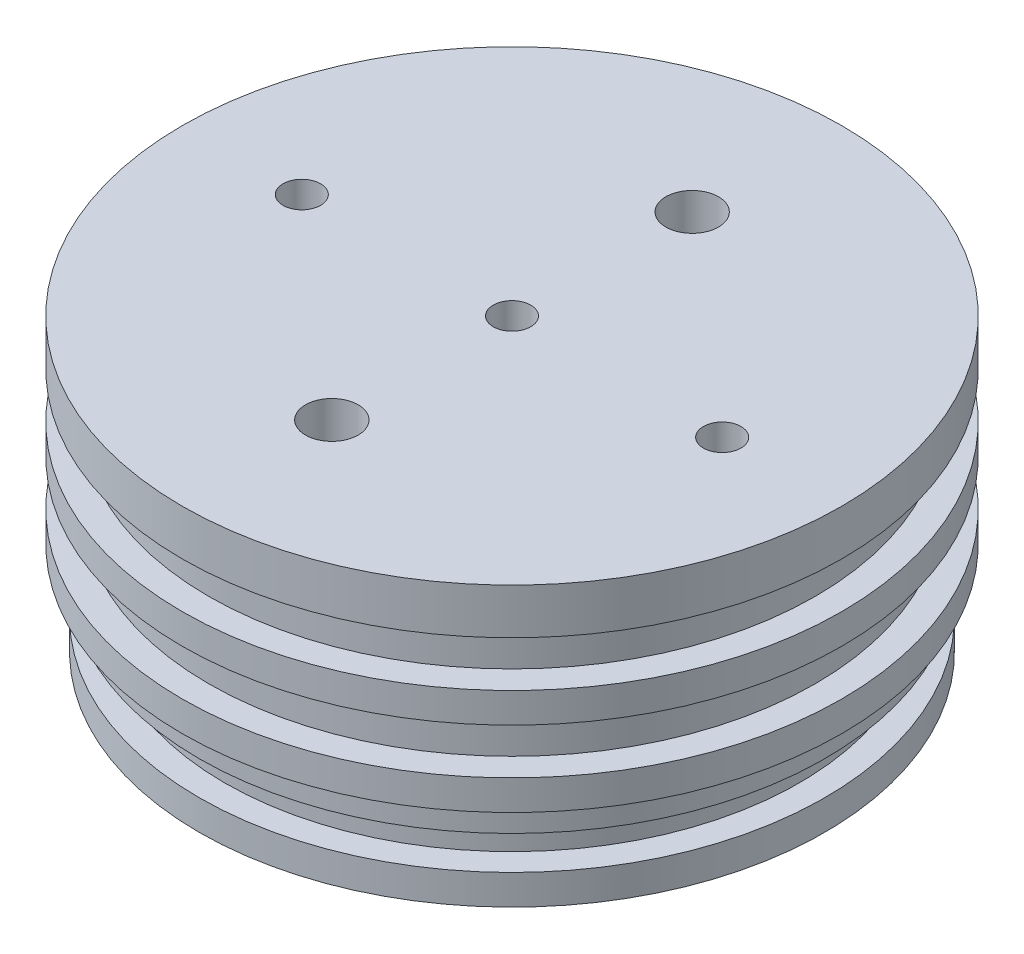
ISO-10303-21;
HEADER;
FILE_DESCRIPTION(('STEP AP214'),'2;1');
FILE_NAME('part.step','',(''),(''),'','','');
FILE_SCHEMA(('AUTOMOTIVE_DESIGN { 1 0 10303 214 1 1 1 1 }'));
ENDSEC;
DATA;
#1=APPLICATION_CONTEXT('core data for automotive mechanical design processes');
#2=APPLICATION_PROTOCOL_DEFINITION('international standard','automotive_design',2000,#1);
#3=PRODUCT_CONTEXT('',#1,'mechanical');
#4=PRODUCT('Part','Part','',(#3));
#5=PRODUCT_RELATED_PRODUCT_CATEGORY('part','',(#4));
#6=PRODUCT_DEFINITION_FORMATION('','',#4);
#7=PRODUCT_DEFINITION_CONTEXT('part definition',#1,'design');
#8=PRODUCT_DEFINITION('design','',#6,#7);
#9=PRODUCT_DEFINITION_SHAPE('','',#8);
#10=(LENGTH_UNIT() NAMED_UNIT(*) SI_UNIT(.MILLI.,.METRE.));
#11=(NAMED_UNIT(*) PLANE_ANGLE_UNIT() SI_UNIT($,.RADIAN.));
#12=(NAMED_UNIT(*) SI_UNIT($,.STERADIAN.) SOLID_ANGLE_UNIT());
#13=UNCERTAINTY_MEASURE_WITH_UNIT(LENGTH_MEASURE(1.E-05),#10,'distance_accuracy_value','');
#14=(GEOMETRIC_REPRESENTATION_CONTEXT(3) GLOBAL_UNCERTAINTY_ASSIGNED_CONTEXT((#13)) GLOBAL_UNIT_ASSIGNED_CONTEXT((#10,
#11,#12)) REPRESENTATION_CONTEXT('',''));
#15=CARTESIAN_POINT('',(0.,0.,0.));
#16=DIRECTION('',(0.,0.,1.));
#17=DIRECTION('',(1.,0.,0.));
#18=AXIS2_PLACEMENT_3D('',#15,#16,#17);
#19=CARTESIAN_POINT('',(0.,-19.8374,0.));
#20=DIRECTION('',(0.,1.,0.));
#21=DIRECTION('',(0.,0.,1.));
#22=AXIS2_PLACEMENT_3D('',#19,#20,#21);
#23=CYLINDRICAL_SURFACE('',#22,66.167);
#24=CARTESIAN_POINT('',(0.,0.,0.));
#25=DIRECTION('',(0.,-1.,0.));
#26=DIRECTION('',(0.,0.,-1.));
#27=AXIS2_PLACEMENT_3D('',#24,#25,#26);
#28=CIRCLE('',#27,66.167);
#29=CARTESIAN_POINT('',(0.,0.,-66.167));
#30=VERTEX_POINT('',#29);
#31=EDGE_CURVE('E11',#30,#30,#28,.T.);
#32=ORIENTED_EDGE('',*,*,#31,.T.);
#33=EDGE_LOOP('',(#32));
#34=FACE_BOUND('',#33,.T.);
#35=CARTESIAN_POINT('',(0.,-6.35,0.));
#36=DIRECTION('',(0.,1.,0.));
#37=DIRECTION('',(0.,0.,1.));
#38=AXIS2_PLACEMENT_3D('',#35,#36,#37);
#39=CIRCLE('',#38,66.167);
#40=CARTESIAN_POINT('',(0.,-6.35,66.167));
#41=VERTEX_POINT('',#40);
#42=EDGE_CURVE('E123',#41,#41,#39,.T.);
#43=ORIENTED_EDGE('',*,*,#42,.T.);
#44=EDGE_LOOP('',(#43));
#45=FACE_BOUND('',#44,.T.);
#46=ADVANCED_FACE('F40',(#34,#45),#23,.T.);
#47=CARTESIAN_POINT('',(0.,41.656,0.));
#48=DIRECTION('',(0.,-1.,0.));
#49=DIRECTION('',(0.,0.,-1.));
#50=AXIS2_PLACEMENT_3D('',#47,#48,#49);
#51=CYLINDRICAL_SURFACE('',#50,69.723);
#52=CARTESIAN_POINT('',(0.,41.656,0.));
#53=DIRECTION('',(0.,1.,0.));
#54=DIRECTION('',(0.,0.,1.));
#55=AXIS2_PLACEMENT_3D('',#52,#53,#54);
#56=CIRCLE('',#55,69.723);
#57=CARTESIAN_POINT('',(0.,41.656,69.723));
#58=VERTEX_POINT('',#57);
#59=EDGE_CURVE('E50',#58,#58,#56,.T.);
#60=ORIENTED_EDGE('',*,*,#59,.F.);
#61=EDGE_LOOP('',(#60));
#62=FACE_BOUND('',#61,.T.);
#63=CARTESIAN_POINT('',(0.,32.004,0.));
#64=DIRECTION('',(0.,1.,0.));
#65=DIRECTION('',(0.,0.,1.));
#66=AXIS2_PLACEMENT_3D('',#63,#64,#65);
#67=CIRCLE('',#66,69.723);
#68=CARTESIAN_POINT('',(0.,32.004,69.723));
#69=VERTEX_POINT('',#68);
#70=EDGE_CURVE('E132',#69,#69,#67,.T.);
#71=ORIENTED_EDGE('',*,*,#70,.T.);
#72=EDGE_LOOP('',(#71));
#73=FACE_BOUND('',#72,.T.);
#74=ADVANCED_FACE('F184',(#62,#73),#51,.T.);
#75=CARTESIAN_POINT('',(0.,41.656,0.));
#76=DIRECTION('',(0.,1.,0.));
#77=DIRECTION('',(0.,0.,1.));
#78=AXIS2_PLACEMENT_3D('',#75,#76,#77);
#79=PLANE('',#78);
#80=CARTESIAN_POINT('',(-44.45,41.656,0.));
#81=DIRECTION('',(0.,1.,0.));
#82=DIRECTION('',(0.,0.,1.));
#83=AXIS2_PLACEMENT_3D('',#80,#81,#82);
#84=CIRCLE('',#83,3.96874999999999);
#85=CARTESIAN_POINT('',(-44.45,41.656,3.96874999999999));
#86=VERTEX_POINT('',#85);
#87=EDGE_CURVE('E73',#86,#86,#84,.T.);
#88=ORIENTED_EDGE('',*,*,#87,.F.);
#89=EDGE_LOOP('',(#88));
#90=FACE_BOUND('',#89,.T.);
#91=CARTESIAN_POINT('',(44.45,41.656,0.));
#92=DIRECTION('',(0.,1.,0.));
#93=DIRECTION('',(0.,0.,1.));
#94=AXIS2_PLACEMENT_3D('',#91,#92,#93);
#95=CIRCLE('',#94,3.96874999999999);
#96=CARTESIAN_POINT('',(44.45,41.656,3.96874999999999));
#97=VERTEX_POINT('',#96);
#98=EDGE_CURVE('E72',#97,#97,#95,.T.);
#99=ORIENTED_EDGE('',*,*,#98,.F.);
#100=EDGE_LOOP('',(#99));
#101=FACE_BOUND('',#100,.T.);
#102=CARTESIAN_POINT('',(0.,41.656,0.));
#103=DIRECTION('',(0.,1.,0.));
#104=DIRECTION('',(0.,0.,1.));
#105=AXIS2_PLACEMENT_3D('',#102,#103,#104);
#106=CIRCLE('',#105,3.96875);
#107=CARTESIAN_POINT('',(0.,41.656,3.96875));
#108=VERTEX_POINT('',#107);
#109=EDGE_CURVE('E87',#108,#108,#106,.T.);
#110=ORIENTED_EDGE('',*,*,#109,.F.);
#111=EDGE_LOOP('',(#110));
#112=FACE_BOUND('',#111,.T.);
#113=CARTESIAN_POINT('',(0.,41.656,38.1));
#114=DIRECTION('',(0.,1.,0.));
#115=DIRECTION('',(0.,0.,1.));
#116=AXIS2_PLACEMENT_3D('',#113,#114,#115);
#117=CIRCLE('',#116,5.5626);
#118=CARTESIAN_POINT('',(0.,41.656,43.6626));
#119=VERTEX_POINT('',#118);
#120=EDGE_CURVE('E95',#119,#119,#117,.T.);
#121=ORIENTED_EDGE('',*,*,#120,.F.);
#122=EDGE_LOOP('',(#121));
#123=FACE_BOUND('',#122,.T.);
#124=CARTESIAN_POINT('',(0.,41.656,-38.1));
#125=DIRECTION('',(0.,1.,0.));
#126=DIRECTION('',(0.,0.,1.));
#127=AXIS2_PLACEMENT_3D('',#124,#125,#126);
#128=CIRCLE('',#127,5.5626);
#129=CARTESIAN_POINT('',(0.,41.656,-32.5374));
#130=VERTEX_POINT('',#129);
#131=EDGE_CURVE('E103',#130,#130,#128,.T.);
#132=ORIENTED_EDGE('',*,*,#131,.F.);
#133=EDGE_LOOP('',(#132));
#134=FACE_BOUND('',#133,.T.);
#135=ORIENTED_EDGE('',*,*,#59,.T.);
#136=EDGE_LOOP('',(#135));
#137=FACE_BOUND('',#136,.T.);
#138=ADVANCED_FACE('F197',(#90,#101,#112,#123,#134,#137),#79,.T.);
#139=CARTESIAN_POINT('',(0.,22.352,-69.723));
#140=DIRECTION('',(0.,1.,0.));
#141=DIRECTION('',(0.,0.,1.));
#142=AXIS2_PLACEMENT_3D('',#139,#140,#141);
#143=PLANE('',#142);
#144=CARTESIAN_POINT('',(0.,22.352,0.));
#145=DIRECTION('',(0.,1.,0.));
#146=DIRECTION('',(0.,0.,1.));
#147=AXIS2_PLACEMENT_3D('',#144,#145,#146);
#148=CIRCLE('',#147,69.723);
#149=CARTESIAN_POINT('',(0.,22.352,69.723));
#150=VERTEX_POINT('',#149);
#151=EDGE_CURVE('E145',#150,#150,#148,.T.);
#152=ORIENTED_EDGE('',*,*,#151,.T.);
#153=EDGE_LOOP('',(#152));
#154=FACE_BOUND('',#153,.T.);
#155=CARTESIAN_POINT('',(0.,22.352,0.));
#156=DIRECTION('',(0.,1.,0.));
#157=DIRECTION('',(0.,0.,1.));
#158=AXIS2_PLACEMENT_3D('',#155,#156,#157);
#159=CIRCLE('',#158,64.135);
#160=CARTESIAN_POINT('',(0.,22.352,64.135));
#161=VERTEX_POINT('',#160);
#162=EDGE_CURVE('E141',#161,#161,#159,.T.);
#163=ORIENTED_EDGE('',*,*,#162,.F.);
#164=EDGE_LOOP('',(#163));
#165=FACE_BOUND('',#164,.T.);
#166=ADVANCED_FACE('F261',(#154,#165),#143,.T.);
#167=CARTESIAN_POINT('',(0.,41.656,0.));
#168=DIRECTION('',(0.,1.,0.));
#169=DIRECTION('',(0.,0.,1.));
#170=AXIS2_PLACEMENT_3D('',#167,#168,#169);
#171=CYLINDRICAL_SURFACE('',#170,64.135);
#172=ORIENTED_EDGE('',*,*,#162,.T.);
#173=EDGE_LOOP('',(#172));
#174=FACE_BOUND('',#173,.T.);
#175=CARTESIAN_POINT('',(0.,32.004,0.));
#176=DIRECTION('',(0.,1.,0.));
#177=DIRECTION('',(0.,0.,1.));
#178=AXIS2_PLACEMENT_3D('',#175,#176,#177);
#179=CIRCLE('',#178,64.135);
#180=CARTESIAN_POINT('',(0.,32.004,64.135));
#181=VERTEX_POINT('',#180);
#182=EDGE_CURVE('E136',#181,#181,#179,.T.);
#183=ORIENTED_EDGE('',*,*,#182,.F.);
#184=EDGE_LOOP('',(#183));
#185=FACE_BOUND('',#184,.T.);
#186=ADVANCED_FACE('F280',(#174,#185),#171,.T.);
#187=CARTESIAN_POINT('',(0.,32.004,-69.723));
#188=DIRECTION('',(0.,-1.,0.));
#189=DIRECTION('',(0.,0.,-1.));
#190=AXIS2_PLACEMENT_3D('',#187,#188,#189);
#191=PLANE('',#190);
#192=ORIENTED_EDGE('',*,*,#182,.T.);
#193=EDGE_LOOP('',(#192));
#194=FACE_BOUND('',#193,.T.);
#195=ORIENTED_EDGE('',*,*,#70,.F.);
#196=EDGE_LOOP('',(#195));
#197=FACE_BOUND('',#196,.T.);
#198=ADVANCED_FACE('F292',(#194,#197),#191,.T.);
#199=CARTESIAN_POINT('',(0.,16.002,0.));
#200=DIRECTION('',(0.,1.,0.));
#201=DIRECTION('',(0.,0.,1.));
#202=AXIS2_PLACEMENT_3D('',#199,#200,#201);
#203=CIRCLE('',#202,69.723);
#204=CARTESIAN_POINT('',(0.,16.002,69.723));
#205=VERTEX_POINT('',#204);
#206=EDGE_CURVE('E130',#205,#205,#203,.T.);
#207=ORIENTED_EDGE('',*,*,#206,.T.);
#208=EDGE_LOOP('',(#207));
#209=FACE_BOUND('',#208,.T.);
#210=ORIENTED_EDGE('',*,*,#151,.F.);
#211=EDGE_LOOP('',(#210));
#212=FACE_BOUND('',#211,.T.);
#213=ADVANCED_FACE('F42',(#209,#212),#51,.T.);
#214=CARTESIAN_POINT('',(0.,6.35,-69.723));
#215=DIRECTION('',(0.,1.,0.));
#216=DIRECTION('',(0.,0.,1.));
#217=AXIS2_PLACEMENT_3D('',#214,#215,#216);
#218=PLANE('',#217);
#219=CARTESIAN_POINT('',(0.,6.35,0.));
#220=DIRECTION('',(0.,1.,0.));
#221=DIRECTION('',(0.,0.,1.));
#222=AXIS2_PLACEMENT_3D('',#219,#220,#221);
#223=CIRCLE('',#222,69.723);
#224=CARTESIAN_POINT('',(0.,6.35,69.723));
#225=VERTEX_POINT('',#224);
#226=EDGE_CURVE('E137',#225,#225,#223,.T.);
#227=ORIENTED_EDGE('',*,*,#226,.T.);
#228=EDGE_LOOP('',(#227));
#229=FACE_BOUND('',#228,.T.);
#230=CARTESIAN_POINT('',(0.,6.35,0.));
#231=DIRECTION('',(0.,1.,0.));
#232=DIRECTION('',(0.,0.,1.));
#233=AXIS2_PLACEMENT_3D('',#230,#231,#232);
#234=CIRCLE('',#233,64.135);
#235=CARTESIAN_POINT('',(0.,6.35,64.135));
#236=VERTEX_POINT('',#235);
#237=EDGE_CURVE('E156',#236,#236,#234,.T.);
#238=ORIENTED_EDGE('',*,*,#237,.F.);
#239=EDGE_LOOP('',(#238));
#240=FACE_BOUND('',#239,.T.);
#241=ADVANCED_FACE('F284',(#229,#240),#218,.T.);
#242=CARTESIAN_POINT('',(0.,41.656,0.));
#243=DIRECTION('',(0.,1.,0.));
#244=DIRECTION('',(0.,0.,1.));
#245=AXIS2_PLACEMENT_3D('',#242,#243,#244);
#246=CYLINDRICAL_SURFACE('',#245,64.135);
#247=ORIENTED_EDGE('',*,*,#237,.T.);
#248=EDGE_LOOP('',(#247));
#249=FACE_BOUND('',#248,.T.);
#250=CARTESIAN_POINT('',(0.,16.002,0.));
#251=DIRECTION('',(0.,1.,0.));
#252=DIRECTION('',(0.,0.,1.));
#253=AXIS2_PLACEMENT_3D('',#250,#251,#252);
#254=CIRCLE('',#253,64.135);
#255=CARTESIAN_POINT('',(0.,16.002,64.135));
#256=VERTEX_POINT('',#255);
#257=EDGE_CURVE('E152',#256,#256,#254,.T.);
#258=ORIENTED_EDGE('',*,*,#257,.F.);
#259=EDGE_LOOP('',(#258));
#260=FACE_BOUND('',#259,.T.);
#261=ADVANCED_FACE('F185',(#249,#260),#246,.T.);
#262=CARTESIAN_POINT('',(0.,16.002,-69.723));
#263=DIRECTION('',(0.,-1.,0.));
#264=DIRECTION('',(0.,0.,-1.));
#265=AXIS2_PLACEMENT_3D('',#262,#263,#264);
#266=PLANE('',#265);
#267=ORIENTED_EDGE('',*,*,#257,.T.);
#268=EDGE_LOOP('',(#267));
#269=FACE_BOUND('',#268,.T.);
#270=ORIENTED_EDGE('',*,*,#206,.F.);
#271=EDGE_LOOP('',(#270));
#272=FACE_BOUND('',#271,.T.);
#273=ADVANCED_FACE('F177',(#269,#272),#266,.T.);
#274=CARTESIAN_POINT('',(0.,0.,0.));
#275=DIRECTION('',(0.,1.,0.));
#276=DIRECTION('',(0.,0.,1.));
#277=AXIS2_PLACEMENT_3D('',#274,#275,#276);
#278=PLANE('',#277);
#279=ORIENTED_EDGE('',*,*,#31,.F.);
#280=EDGE_LOOP('',(#279));
#281=FACE_BOUND('',#280,.T.);
#282=CARTESIAN_POINT('',(0.,0.,0.));
#283=DIRECTION('',(0.,1.,0.));
#284=DIRECTION('',(0.,0.,1.));
#285=AXIS2_PLACEMENT_3D('',#282,#283,#284);
#286=CIRCLE('',#285,69.723);
#287=CARTESIAN_POINT('',(0.,0.,69.723));
#288=VERTEX_POINT('',#287);
#289=EDGE_CURVE('E44',#288,#288,#286,.T.);
#290=ORIENTED_EDGE('',*,*,#289,.F.);
#291=EDGE_LOOP('',(#290));
#292=FACE_BOUND('',#291,.T.);
#293=ADVANCED_FACE('F175',(#281,#292),#278,.F.);
#294=ORIENTED_EDGE('',*,*,#289,.T.);
#295=EDGE_LOOP('',(#294));
#296=FACE_BOUND('',#295,.T.);
#297=ORIENTED_EDGE('',*,*,#226,.F.);
#298=EDGE_LOOP('',(#297));
#299=FACE_BOUND('',#298,.T.);
#300=ADVANCED_FACE('F172',(#296,#299),#51,.T.);
#301=CARTESIAN_POINT('',(0.,-6.35,-66.167));
#302=DIRECTION('',(0.,-1.,0.));
#303=DIRECTION('',(0.,0.,-1.));
#304=AXIS2_PLACEMENT_3D('',#301,#302,#303);
#305=PLANE('',#304);
#306=CARTESIAN_POINT('',(0.,-6.35,0.));
#307=DIRECTION('',(0.,1.,0.));
#308=DIRECTION('',(0.,0.,1.));
#309=AXIS2_PLACEMENT_3D('',#306,#307,#308);
#310=CIRCLE('',#309,60.7695);
#311=CARTESIAN_POINT('',(0.,-6.35,60.7695));
#312=VERTEX_POINT('',#311);
#313=EDGE_CURVE('E119',#312,#312,#310,.T.);
#314=ORIENTED_EDGE('',*,*,#313,.T.);
#315=EDGE_LOOP('',(#314));
#316=FACE_BOUND('',#315,.T.);
#317=ORIENTED_EDGE('',*,*,#42,.F.);
#318=EDGE_LOOP('',(#317));
#319=FACE_BOUND('',#318,.T.);
#320=ADVANCED_FACE('F183',(#316,#319),#305,.T.);
#321=CARTESIAN_POINT('',(0.,41.656,0.));
#322=DIRECTION('',(0.,1.,0.));
#323=DIRECTION('',(0.,0.,1.));
#324=AXIS2_PLACEMENT_3D('',#321,#322,#323);
#325=CYLINDRICAL_SURFACE('',#324,60.7695);
#326=CARTESIAN_POINT('',(0.,-13.4874,0.));
#327=DIRECTION('',(0.,1.,0.));
#328=DIRECTION('',(0.,0.,1.));
#329=AXIS2_PLACEMENT_3D('',#326,#327,#328);
#330=CIRCLE('',#329,60.7695);
#331=CARTESIAN_POINT('',(0.,-13.4874,60.7695));
#332=VERTEX_POINT('',#331);
#333=EDGE_CURVE('E115',#332,#332,#330,.T.);
#334=ORIENTED_EDGE('',*,*,#333,.T.);
#335=EDGE_LOOP('',(#334));
#336=FACE_BOUND('',#335,.T.);
#337=ORIENTED_EDGE('',*,*,#313,.F.);
#338=EDGE_LOOP('',(#337));
#339=FACE_BOUND('',#338,.T.);
#340=ADVANCED_FACE('F221',(#336,#339),#325,.T.);
#341=CARTESIAN_POINT('',(0.,-13.4874,-66.167));
#342=DIRECTION('',(0.,1.,0.));
#343=DIRECTION('',(0.,0.,1.));
#344=AXIS2_PLACEMENT_3D('',#341,#342,#343);
#345=PLANE('',#344);
#346=CARTESIAN_POINT('',(0.,-13.4874,0.));
#347=DIRECTION('',(0.,1.,0.));
#348=DIRECTION('',(0.,0.,1.));
#349=AXIS2_PLACEMENT_3D('',#346,#347,#348);
#350=CIRCLE('',#349,66.167);
#351=CARTESIAN_POINT('',(0.,-13.4874,66.167));
#352=VERTEX_POINT('',#351);
#353=EDGE_CURVE('E111',#352,#352,#350,.T.);
#354=ORIENTED_EDGE('',*,*,#353,.T.);
#355=EDGE_LOOP('',(#354));
#356=FACE_BOUND('',#355,.T.);
#357=ORIENTED_EDGE('',*,*,#333,.F.);
#358=EDGE_LOOP('',(#357));
#359=FACE_BOUND('',#358,.T.);
#360=ADVANCED_FACE('F213',(#356,#359),#345,.T.);
#361=CARTESIAN_POINT('',(0.,-19.8374,0.));
#362=DIRECTION('',(0.,-1.,0.));
#363=DIRECTION('',(0.,0.,-1.));
#364=AXIS2_PLACEMENT_3D('',#361,#362,#363);
#365=PLANE('',#364);
#366=CARTESIAN_POINT('',(0.,-19.8374,38.1));
#367=DIRECTION('',(0.,-1.,0.));
#368=DIRECTION('',(0.,0.,-1.));
#369=AXIS2_PLACEMENT_3D('',#366,#367,#368);
#370=CIRCLE('',#369,5.56259999999999);
#371=CARTESIAN_POINT('',(0.,-19.8374,32.5374));
#372=VERTEX_POINT('',#371);
#373=EDGE_CURVE('E99',#372,#372,#370,.T.);
#374=ORIENTED_EDGE('',*,*,#373,.F.);
#375=EDGE_LOOP('',(#374));
#376=FACE_BOUND('',#375,.T.);
#377=CARTESIAN_POINT('',(0.,-19.8374,-38.1));
#378=DIRECTION('',(0.,-1.,0.));
#379=DIRECTION('',(0.,0.,-1.));
#380=AXIS2_PLACEMENT_3D('',#377,#378,#379);
#381=CIRCLE('',#380,5.56259999999999);
#382=CARTESIAN_POINT('',(0.,-19.8374,-43.6626));
#383=VERTEX_POINT('',#382);
#384=EDGE_CURVE('E107',#383,#383,#381,.T.);
#385=ORIENTED_EDGE('',*,*,#384,.F.);
#386=EDGE_LOOP('',(#385));
#387=FACE_BOUND('',#386,.T.);
#388=CARTESIAN_POINT('',(0.,-19.8374,0.));
#389=DIRECTION('',(0.,-1.,0.));
#390=DIRECTION('',(0.,0.,-1.));
#391=AXIS2_PLACEMENT_3D('',#388,#389,#390);
#392=CIRCLE('',#391,66.167);
#393=CARTESIAN_POINT('',(0.,-19.8374,-66.167));
#394=VERTEX_POINT('',#393);
#395=EDGE_CURVE('E127',#394,#394,#392,.T.);
#396=ORIENTED_EDGE('',*,*,#395,.T.);
#397=EDGE_LOOP('',(#396));
#398=FACE_BOUND('',#397,.T.);
#399=ADVANCED_FACE('F204',(#376,#387,#398),#365,.T.);
#400=ORIENTED_EDGE('',*,*,#395,.F.);
#401=EDGE_LOOP('',(#400));
#402=FACE_BOUND('',#401,.T.);
#403=ORIENTED_EDGE('',*,*,#353,.F.);
#404=EDGE_LOOP('',(#403));
#405=FACE_BOUND('',#404,.T.);
#406=ADVANCED_FACE('F193',(#402,#405),#23,.T.);
#407=CARTESIAN_POINT('',(0.,41.656,-38.1));
#408=DIRECTION('',(0.,1.,0.));
#409=DIRECTION('',(0.,0.,1.));
#410=AXIS2_PLACEMENT_3D('',#407,#408,#409);
#411=CYLINDRICAL_SURFACE('',#410,5.56259999999999);
#412=ORIENTED_EDGE('',*,*,#131,.T.);
#413=EDGE_LOOP('',(#412));
#414=FACE_BOUND('',#413,.T.);
#415=ORIENTED_EDGE('',*,*,#384,.T.);
#416=EDGE_LOOP('',(#415));
#417=FACE_BOUND('',#416,.T.);
#418=ADVANCED_FACE('F203',(#414,#417),#411,.F.);
#419=CARTESIAN_POINT('',(0.,41.656,38.1));
#420=DIRECTION('',(0.,1.,0.));
#421=DIRECTION('',(0.,0.,1.));
#422=AXIS2_PLACEMENT_3D('',#419,#420,#421);
#423=CYLINDRICAL_SURFACE('',#422,5.56259999999999);
#424=ORIENTED_EDGE('',*,*,#120,.T.);
#425=EDGE_LOOP('',(#424));
#426=FACE_BOUND('',#425,.T.);
#427=ORIENTED_EDGE('',*,*,#373,.T.);
#428=EDGE_LOOP('',(#427));
#429=FACE_BOUND('',#428,.T.);
#430=ADVANCED_FACE('F210',(#426,#429),#423,.F.);
#431=CARTESIAN_POINT('',(0.,16.256,0.));
#432=DIRECTION('',(0.,1.,0.));
#433=DIRECTION('',(0.,0.,1.));
#434=AXIS2_PLACEMENT_3D('',#431,#432,#433);
#435=CONICAL_SURFACE('',#434,3.96874999999999,1.02974425867665);
#436=CARTESIAN_POINT('',(0.,13.8713344182344,0.));
#437=VERTEX_POINT('',#436);
#438=VERTEX_LOOP('',#437);
#439=FACE_BOUND('',#438,.T.);
#440=CARTESIAN_POINT('',(0.,16.256,0.));
#441=DIRECTION('',(0.,1.,0.));
#442=DIRECTION('',(0.,0.,1.));
#443=AXIS2_PLACEMENT_3D('',#440,#441,#442);
#444=CIRCLE('',#443,3.96874999999999);
#445=CARTESIAN_POINT('',(0.,16.256,3.96874999999999));
#446=VERTEX_POINT('',#445);
#447=EDGE_CURVE('E91',#446,#446,#444,.T.);
#448=ORIENTED_EDGE('',*,*,#447,.T.);
#449=EDGE_LOOP('',(#448));
#450=FACE_BOUND('',#449,.T.);
#451=ADVANCED_FACE('F239',(#439,#450),#435,.F.);
#452=CARTESIAN_POINT('',(0.,41.656,0.));
#453=DIRECTION('',(0.,1.,0.));
#454=DIRECTION('',(0.,0.,1.));
#455=AXIS2_PLACEMENT_3D('',#452,#453,#454);
#456=CYLINDRICAL_SURFACE('',#455,3.96875);
#457=ORIENTED_EDGE('',*,*,#447,.F.);
#458=EDGE_LOOP('',(#457));
#459=FACE_BOUND('',#458,.T.);
#460=ORIENTED_EDGE('',*,*,#109,.T.);
#461=EDGE_LOOP('',(#460));
#462=FACE_BOUND('',#461,.T.);
#463=ADVANCED_FACE('F243',(#459,#462),#456,.F.);
#464=CARTESIAN_POINT('',(44.45,22.606,0.));
#465=DIRECTION('',(0.,1.,0.));
#466=DIRECTION('',(0.,0.,1.));
#467=AXIS2_PLACEMENT_3D('',#464,#465,#466);
#468=CONICAL_SURFACE('',#467,3.96874999999999,1.02974425867665);
#469=CARTESIAN_POINT('',(44.45,20.2213344182344,0.));
#470=VERTEX_POINT('',#469);
#471=VERTEX_LOOP('',#470);
#472=FACE_BOUND('',#471,.T.);
#473=CARTESIAN_POINT('',(44.45,22.606,0.));
#474=DIRECTION('',(0.,1.,0.));
#475=DIRECTION('',(0.,0.,1.));
#476=AXIS2_PLACEMENT_3D('',#473,#474,#475);
#477=CIRCLE('',#476,3.96874999999999);
#478=CARTESIAN_POINT('',(44.45,22.606,3.96874999999999));
#479=VERTEX_POINT('',#478);
#480=EDGE_CURVE('E79',#479,#479,#477,.T.);
#481=ORIENTED_EDGE('',*,*,#480,.T.);
#482=EDGE_LOOP('',(#481));
#483=FACE_BOUND('',#482,.T.);
#484=ADVANCED_FACE('F246',(#472,#483),#468,.F.);
#485=CARTESIAN_POINT('',(44.45,41.656,0.));
#486=DIRECTION('',(0.,1.,0.));
#487=DIRECTION('',(0.,0.,1.));
#488=AXIS2_PLACEMENT_3D('',#485,#486,#487);
#489=CYLINDRICAL_SURFACE('',#488,3.96874999999999);
#490=ORIENTED_EDGE('',*,*,#480,.F.);
#491=EDGE_LOOP('',(#490));
#492=FACE_BOUND('',#491,.T.);
#493=ORIENTED_EDGE('',*,*,#98,.T.);
#494=EDGE_LOOP('',(#493));
#495=FACE_BOUND('',#494,.T.);
#496=ADVANCED_FACE('F65',(#492,#495),#489,.F.);
#497=CARTESIAN_POINT('',(-44.45,22.606,0.));
#498=DIRECTION('',(0.,1.,0.));
#499=DIRECTION('',(0.,0.,1.));
#500=AXIS2_PLACEMENT_3D('',#497,#498,#499);
#501=CONICAL_SURFACE('',#500,3.96874999999999,1.02974425867665);
#502=CARTESIAN_POINT('',(-44.45,20.2213344182344,0.));
#503=VERTEX_POINT('',#502);
#504=VERTEX_LOOP('',#503);
#505=FACE_BOUND('',#504,.T.);
#506=CARTESIAN_POINT('',(-44.45,22.606,0.));
#507=DIRECTION('',(0.,1.,0.));
#508=DIRECTION('',(0.,0.,1.));
#509=AXIS2_PLACEMENT_3D('',#506,#507,#508);
#510=CIRCLE('',#509,3.96874999999999);
#511=CARTESIAN_POINT('',(-44.45,22.606,3.96874999999999));
#512=VERTEX_POINT('',#511);
#513=EDGE_CURVE('E69',#512,#512,#510,.T.);
#514=ORIENTED_EDGE('',*,*,#513,.T.);
#515=EDGE_LOOP('',(#514));
#516=FACE_BOUND('',#515,.T.);
#517=ADVANCED_FACE('F61',(#505,#516),#501,.F.);
#518=CARTESIAN_POINT('',(-44.45,41.656,0.));
#519=DIRECTION('',(0.,1.,0.));
#520=DIRECTION('',(0.,0.,1.));
#521=AXIS2_PLACEMENT_3D('',#518,#519,#520);
#522=CYLINDRICAL_SURFACE('',#521,3.96874999999999);
#523=ORIENTED_EDGE('',*,*,#513,.F.);
#524=EDGE_LOOP('',(#523));
#525=FACE_BOUND('',#524,.T.);
#526=ORIENTED_EDGE('',*,*,#87,.T.);
#527=EDGE_LOOP('',(#526));
#528=FACE_BOUND('',#527,.T.);
#529=ADVANCED_FACE('F64',(#525,#528),#522,.F.);
#530=CLOSED_SHELL('',(#46,#74,#138,#166,#186,#198,#213,#241,#261,#273,#293,#300,#320,#340,#360,
#399,#406,#418,#430,#451,#463,#484,#496,#517,#529));
#531=MANIFOLD_SOLID_BREP('B2',#530);
#532=ADVANCED_BREP_SHAPE_REPRESENTATION('',(#18,#531),#14);
#533=SHAPE_DEFINITION_REPRESENTATION(#9,#532);
ENDSEC;
END-ISO-10303-21;
